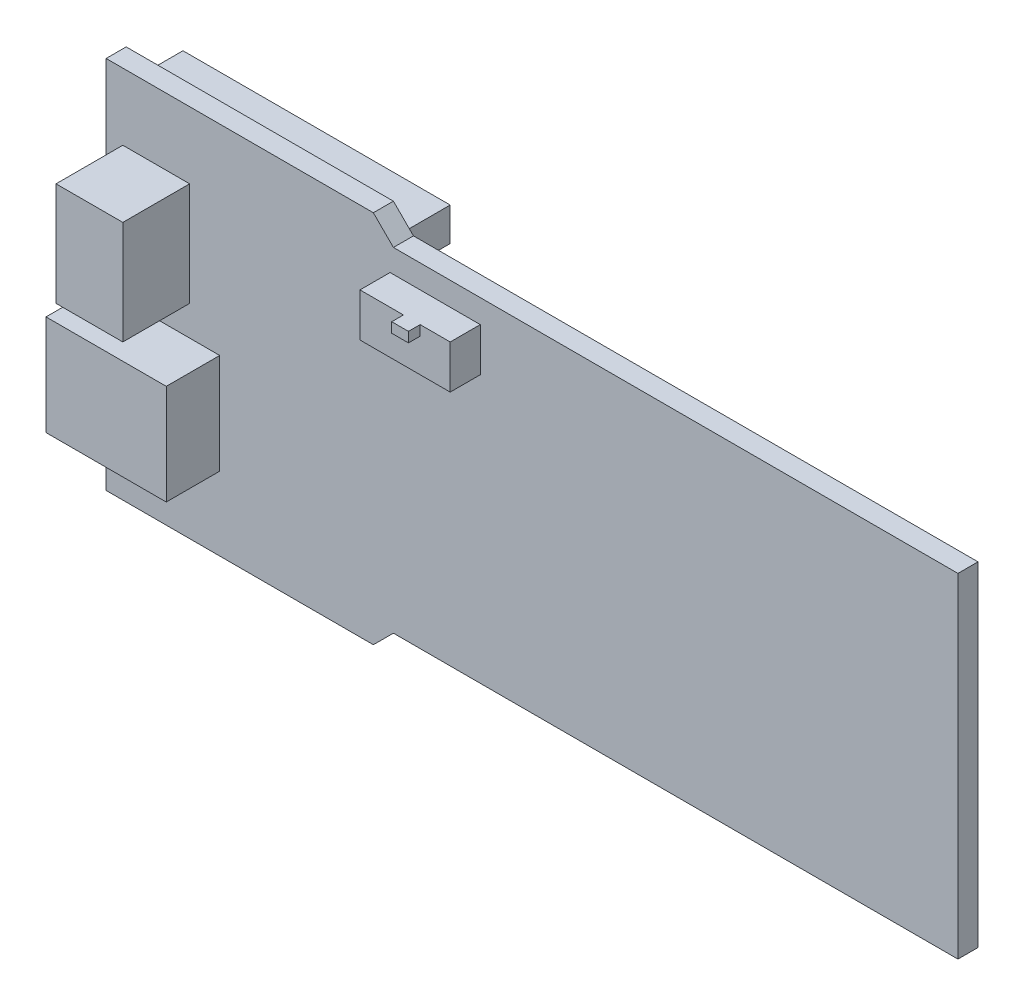
ISO-10303-21;
HEADER;
FILE_DESCRIPTION(('STEP AP214'),'2;1');
FILE_NAME('part.step','',(''),(''),'','','');
FILE_SCHEMA(('AUTOMOTIVE_DESIGN { 1 0 10303 214 1 1 1 1 }'));
ENDSEC;
DATA;
#1=APPLICATION_CONTEXT('core data for automotive mechanical design processes');
#2=APPLICATION_PROTOCOL_DEFINITION('international standard','automotive_design',2000,#1);
#3=PRODUCT_CONTEXT('',#1,'mechanical');
#4=PRODUCT('Part','Part','',(#3));
#5=PRODUCT_RELATED_PRODUCT_CATEGORY('part','',(#4));
#6=PRODUCT_DEFINITION_FORMATION('','',#4);
#7=PRODUCT_DEFINITION_CONTEXT('part definition',#1,'design');
#8=PRODUCT_DEFINITION('design','',#6,#7);
#9=PRODUCT_DEFINITION_SHAPE('','',#8);
#10=(LENGTH_UNIT() NAMED_UNIT(*) SI_UNIT(.MILLI.,.METRE.));
#11=(NAMED_UNIT(*) PLANE_ANGLE_UNIT() SI_UNIT($,.RADIAN.));
#12=(NAMED_UNIT(*) SI_UNIT($,.STERADIAN.) SOLID_ANGLE_UNIT());
#13=UNCERTAINTY_MEASURE_WITH_UNIT(LENGTH_MEASURE(1.E-05),#10,'distance_accuracy_value','');
#14=(GEOMETRIC_REPRESENTATION_CONTEXT(3) GLOBAL_UNCERTAINTY_ASSIGNED_CONTEXT((#13)) GLOBAL_UNIT_ASSIGNED_CONTEXT((#10,
#11,#12)) REPRESENTATION_CONTEXT('',''));
#15=CARTESIAN_POINT('',(0.,0.,0.));
#16=DIRECTION('',(0.,0.,1.));
#17=DIRECTION('',(1.,0.,0.));
#18=AXIS2_PLACEMENT_3D('',#15,#16,#17);
#19=CARTESIAN_POINT('',(0.,0.,3.81));
#20=DIRECTION('',(0.,0.,-1.));
#21=DIRECTION('',(-1.,0.,0.));
#22=AXIS2_PLACEMENT_3D('',#19,#20,#21);
#23=PLANE('',#22);
#24=DIRECTION('',(0.,1.,0.));
#25=VECTOR('',#24,1.);
#26=CARTESIAN_POINT('',(-6.21843810885279,10.922,3.81));
#27=LINE('',#26,#25);
#28=CARTESIAN_POINT('',(-6.21843810885279,10.16,3.81));
#29=VERTEX_POINT('',#28);
#30=CARTESIAN_POINT('',(-6.21843810885279,10.922,3.81));
#31=VERTEX_POINT('',#30);
#32=EDGE_CURVE('E36',#29,#31,#27,.T.);
#33=ORIENTED_EDGE('',*,*,#32,.F.);
#34=DIRECTION('',(1.,0.,0.));
#35=VECTOR('',#34,1.);
#36=CARTESIAN_POINT('',(-6.21843810885279,10.16,3.81));
#37=LINE('',#36,#35);
#38=CARTESIAN_POINT('',(-7.48843810885279,10.16,3.81));
#39=VERTEX_POINT('',#38);
#40=EDGE_CURVE('E270',#39,#29,#37,.T.);
#41=ORIENTED_EDGE('',*,*,#40,.F.);
#42=DIRECTION('',(0.,-1.,0.));
#43=VECTOR('',#42,1.);
#44=CARTESIAN_POINT('',(-7.48843810885279,10.922,3.81));
#45=LINE('',#44,#43);
#46=CARTESIAN_POINT('',(-7.48843810885279,10.922,3.81));
#47=VERTEX_POINT('',#46);
#48=EDGE_CURVE('E56',#47,#39,#45,.T.);
#49=ORIENTED_EDGE('',*,*,#48,.F.);
#50=DIRECTION('',(-1.,0.,0.));
#51=VECTOR('',#50,1.);
#52=CARTESIAN_POINT('',(-10.7904381088528,10.922,3.81));
#53=LINE('',#52,#51);
#54=CARTESIAN_POINT('',(-10.7904381088528,10.922,3.81));
#55=VERTEX_POINT('',#54);
#56=EDGE_CURVE('E287',#47,#55,#53,.T.);
#57=ORIENTED_EDGE('',*,*,#56,.T.);
#58=DIRECTION('',(0.,-1.,0.));
#59=VECTOR('',#58,1.);
#60=CARTESIAN_POINT('',(-10.7904381088528,7.62,3.81));
#61=LINE('',#60,#59);
#62=CARTESIAN_POINT('',(-10.7904381088528,7.62,3.81));
#63=VERTEX_POINT('',#62);
#64=EDGE_CURVE('E305',#55,#63,#61,.T.);
#65=ORIENTED_EDGE('',*,*,#64,.T.);
#66=DIRECTION('',(1.,0.,0.));
#67=VECTOR('',#66,1.);
#68=CARTESIAN_POINT('',(-10.7904381088528,7.62,3.81));
#69=LINE('',#68,#67);
#70=CARTESIAN_POINT('',(-3.93243810885279,7.62,3.81));
#71=VERTEX_POINT('',#70);
#72=EDGE_CURVE('E948',#63,#71,#69,.T.);
#73=ORIENTED_EDGE('',*,*,#72,.T.);
#74=DIRECTION('',(0.,1.,0.));
#75=VECTOR('',#74,1.);
#76=CARTESIAN_POINT('',(-3.93243810885279,7.62,3.81));
#77=LINE('',#76,#75);
#78=CARTESIAN_POINT('',(-3.93243810885279,10.922,3.81));
#79=VERTEX_POINT('',#78);
#80=EDGE_CURVE('E291',#71,#79,#77,.T.);
#81=ORIENTED_EDGE('',*,*,#80,.T.);
#82=EDGE_CURVE('E290',#79,#31,#53,.T.);
#83=ORIENTED_EDGE('',*,*,#82,.T.);
#84=EDGE_LOOP('',(#33,#41,#49,#57,#65,#73,#81,#83));
#85=FACE_BOUND('',#84,.T.);
#86=ADVANCED_FACE('F32',(#85),#23,.F.);
#87=CARTESIAN_POINT('',(0.,0.,1.524));
#88=DIRECTION('',(0.,0.,-1.));
#89=DIRECTION('',(-1.,0.,0.));
#90=AXIS2_PLACEMENT_3D('',#87,#88,#89);
#91=PLANE('',#90);
#92=DIRECTION('',(0.,-1.,0.));
#93=VECTOR('',#92,1.);
#94=CARTESIAN_POINT('',(-31.1104381088528,1.27,1.524));
#95=LINE('',#94,#93);
#96=CARTESIAN_POINT('',(-31.1104381088528,9.144,1.524));
#97=VERTEX_POINT('',#96);
#98=CARTESIAN_POINT('',(-31.1104381088528,1.27,1.524));
#99=VERTEX_POINT('',#98);
#100=EDGE_CURVE('E379',#97,#99,#95,.T.);
#101=ORIENTED_EDGE('',*,*,#100,.F.);
#102=DIRECTION('',(-1.,0.,0.));
#103=VECTOR('',#102,1.);
#104=CARTESIAN_POINT('',(-31.1104381088528,9.144,1.524));
#105=LINE('',#104,#103);
#106=CARTESIAN_POINT('',(-26.0304381088528,9.144,1.524));
#107=VERTEX_POINT('',#106);
#108=EDGE_CURVE('E384',#107,#97,#105,.T.);
#109=ORIENTED_EDGE('',*,*,#108,.F.);
#110=DIRECTION('',(0.,1.,0.));
#111=VECTOR('',#110,1.);
#112=CARTESIAN_POINT('',(-26.0304381088528,1.27,1.524));
#113=LINE('',#112,#111);
#114=CARTESIAN_POINT('',(-26.0304381088528,1.27,1.524));
#115=VERTEX_POINT('',#114);
#116=EDGE_CURVE('E396',#115,#107,#113,.T.);
#117=ORIENTED_EDGE('',*,*,#116,.F.);
#118=DIRECTION('',(1.,0.,0.));
#119=VECTOR('',#118,1.);
#120=CARTESIAN_POINT('',(-31.1104381088528,1.27,1.524));
#121=LINE('',#120,#119);
#122=EDGE_CURVE('E393',#99,#115,#121,.T.);
#123=ORIENTED_EDGE('',*,*,#122,.F.);
#124=EDGE_LOOP('',(#101,#109,#117,#123));
#125=FACE_BOUND('',#124,.T.);
#126=DIRECTION('',(-1.,0.,0.));
#127=VECTOR('',#126,1.);
#128=CARTESIAN_POINT('',(-32.8884381088528,-1.016,1.524));
#129=LINE('',#128,#127);
#130=CARTESIAN_POINT('',(-23.7444381088528,-1.016,1.524));
#131=VERTEX_POINT('',#130);
#132=CARTESIAN_POINT('',(-32.3804381088528,-1.016,1.524));
#133=VERTEX_POINT('',#132);
#134=EDGE_CURVE('E417',#131,#133,#129,.T.);
#135=ORIENTED_EDGE('',*,*,#134,.F.);
#136=DIRECTION('',(0.,1.,0.));
#137=VECTOR('',#136,1.);
#138=CARTESIAN_POINT('',(-23.7444381088528,-8.636,1.524));
#139=LINE('',#138,#137);
#140=CARTESIAN_POINT('',(-23.7444381088528,-8.636,1.524));
#141=VERTEX_POINT('',#140);
#142=EDGE_CURVE('E427',#141,#131,#139,.T.);
#143=ORIENTED_EDGE('',*,*,#142,.F.);
#144=DIRECTION('',(1.,0.,0.));
#145=VECTOR('',#144,1.);
#146=CARTESIAN_POINT('',(-32.8884381088528,-8.636,1.524));
#147=LINE('',#146,#145);
#148=CARTESIAN_POINT('',(-32.3804381088528,-8.636,1.524));
#149=VERTEX_POINT('',#148);
#150=EDGE_CURVE('E11',#149,#141,#147,.T.);
#151=ORIENTED_EDGE('',*,*,#150,.F.);
#152=DIRECTION('',(0.,-1.,0.));
#153=VECTOR('',#152,1.);
#154=CARTESIAN_POINT('',(-32.3804381088528,-14.224,1.524));
#155=LINE('',#154,#153);
#156=CARTESIAN_POINT('',(-32.3804381088528,-14.224,1.524));
#157=VERTEX_POINT('',#156);
#158=EDGE_CURVE('E455',#149,#157,#155,.T.);
#159=ORIENTED_EDGE('',*,*,#158,.T.);
#160=DIRECTION('',(1.,0.,0.));
#161=VECTOR('',#160,1.);
#162=CARTESIAN_POINT('',(-32.3804381088528,-14.224,1.524));
#163=LINE('',#162,#161);
#164=CARTESIAN_POINT('',(-12.0604381088528,-14.224,1.524));
#165=VERTEX_POINT('',#164);
#166=EDGE_CURVE('E459',#157,#165,#163,.T.);
#167=ORIENTED_EDGE('',*,*,#166,.T.);
#168=DIRECTION('',(0.707106781186546,0.707106781186549,0.));
#169=VECTOR('',#168,1.);
#170=CARTESIAN_POINT('',(-12.0604381088528,-14.224,1.524));
#171=LINE('',#170,#169);
#172=CARTESIAN_POINT('',(-10.5364381088528,-12.7,1.524));
#173=VERTEX_POINT('',#172);
#174=EDGE_CURVE('E462',#165,#173,#171,.T.);
#175=ORIENTED_EDGE('',*,*,#174,.T.);
#176=DIRECTION('',(1.,0.,0.));
#177=VECTOR('',#176,1.);
#178=CARTESIAN_POINT('',(-10.5364381088528,-12.7,1.524));
#179=LINE('',#178,#177);
#180=CARTESIAN_POINT('',(32.3895617923525,-12.7,1.524));
#181=VERTEX_POINT('',#180);
#182=EDGE_CURVE('E464',#173,#181,#179,.T.);
#183=ORIENTED_EDGE('',*,*,#182,.T.);
#184=DIRECTION('',(0.,1.,0.));
#185=VECTOR('',#184,1.);
#186=CARTESIAN_POINT('',(32.3895617923525,-12.7,1.524));
#187=LINE('',#186,#185);
#188=CARTESIAN_POINT('',(32.3895617923525,12.7,1.524));
#189=VERTEX_POINT('',#188);
#190=EDGE_CURVE('E445',#181,#189,#187,.T.);
#191=ORIENTED_EDGE('',*,*,#190,.T.);
#192=DIRECTION('',(-1.,0.,0.));
#193=VECTOR('',#192,1.);
#194=CARTESIAN_POINT('',(-10.5364381088528,12.7,1.524));
#195=LINE('',#194,#193);
#196=CARTESIAN_POINT('',(-10.5364381088528,12.7,1.524));
#197=VERTEX_POINT('',#196);
#198=EDGE_CURVE('E448',#189,#197,#195,.T.);
#199=ORIENTED_EDGE('',*,*,#198,.T.);
#200=DIRECTION('',(-0.707106781186546,0.707106781186549,0.));
#201=VECTOR('',#200,1.);
#202=CARTESIAN_POINT('',(-12.0604381088528,14.224,1.524));
#203=LINE('',#202,#201);
#204=CARTESIAN_POINT('',(-12.0604381088528,14.224,1.524));
#205=VERTEX_POINT('',#204);
#206=EDGE_CURVE('E451',#197,#205,#203,.T.);
#207=ORIENTED_EDGE('',*,*,#206,.T.);
#208=DIRECTION('',(-1.,0.,0.));
#209=VECTOR('',#208,1.);
#210=CARTESIAN_POINT('',(-32.3804381088528,14.224,1.524));
#211=LINE('',#210,#209);
#212=CARTESIAN_POINT('',(-32.3804381088528,14.224,1.524));
#213=VERTEX_POINT('',#212);
#214=EDGE_CURVE('E453',#205,#213,#211,.T.);
#215=ORIENTED_EDGE('',*,*,#214,.T.);
#216=EDGE_CURVE('E456',#213,#133,#155,.T.);
#217=ORIENTED_EDGE('',*,*,#216,.T.);
#218=EDGE_LOOP('',(#135,#143,#151,#159,#167,#175,#183,#191,#199,#207,#215,#217));
#219=FACE_BOUND('',#218,.T.);
#220=DIRECTION('',(0.,-1.,0.));
#221=VECTOR('',#220,1.);
#222=CARTESIAN_POINT('',(-10.7904381088528,7.62,1.524));
#223=LINE('',#222,#221);
#224=CARTESIAN_POINT('',(-10.7904381088528,10.922,1.524));
#225=VERTEX_POINT('',#224);
#226=CARTESIAN_POINT('',(-10.7904381088528,7.62,1.524));
#227=VERTEX_POINT('',#226);
#228=EDGE_CURVE('E273',#225,#227,#223,.T.);
#229=ORIENTED_EDGE('',*,*,#228,.F.);
#230=DIRECTION('',(-1.,0.,0.));
#231=VECTOR('',#230,1.);
#232=CARTESIAN_POINT('',(-10.7904381088528,10.922,1.524));
#233=LINE('',#232,#231);
#234=CARTESIAN_POINT('',(-3.93243810885279,10.922,1.524));
#235=VERTEX_POINT('',#234);
#236=EDGE_CURVE('E303',#235,#225,#233,.T.);
#237=ORIENTED_EDGE('',*,*,#236,.F.);
#238=DIRECTION('',(0.,1.,0.));
#239=VECTOR('',#238,1.);
#240=CARTESIAN_POINT('',(-3.93243810885279,7.62,1.524));
#241=LINE('',#240,#239);
#242=CARTESIAN_POINT('',(-3.93243810885279,7.62,1.524));
#243=VERTEX_POINT('',#242);
#244=EDGE_CURVE('E300',#243,#235,#241,.T.);
#245=ORIENTED_EDGE('',*,*,#244,.F.);
#246=DIRECTION('',(1.,0.,0.));
#247=VECTOR('',#246,1.);
#248=CARTESIAN_POINT('',(-10.7904381088528,7.62,1.524));
#249=LINE('',#248,#247);
#250=EDGE_CURVE('E276',#227,#243,#249,.T.);
#251=ORIENTED_EDGE('',*,*,#250,.F.);
#252=EDGE_LOOP('',(#229,#237,#245,#251));
#253=FACE_BOUND('',#252,.T.);
#254=ADVANCED_FACE('F528',(#125,#219,#253),#91,.F.);
#255=CARTESIAN_POINT('',(0.,0.,0.));
#256=DIRECTION('',(0.,0.,-1.));
#257=DIRECTION('',(-1.,0.,0.));
#258=AXIS2_PLACEMENT_3D('',#255,#256,#257);
#259=PLANE('',#258);
#260=DIRECTION('',(0.,-1.,0.));
#261=VECTOR('',#260,1.);
#262=CARTESIAN_POINT('',(-31.8724381088528,-12.319,0.));
#263=LINE('',#262,#261);
#264=CARTESIAN_POINT('',(-31.8724381088528,-9.779,0.));
#265=VERTEX_POINT('',#264);
#266=CARTESIAN_POINT('',(-31.8724381088528,-12.319,0.));
#267=VERTEX_POINT('',#266);
#268=EDGE_CURVE('E318',#265,#267,#263,.T.);
#269=ORIENTED_EDGE('',*,*,#268,.T.);
#270=DIRECTION('',(1.,0.,0.));
#271=VECTOR('',#270,1.);
#272=CARTESIAN_POINT('',(-31.8724381088528,-12.319,0.));
#273=LINE('',#272,#271);
#274=CARTESIAN_POINT('',(-11.5524381088528,-12.319,0.));
#275=VERTEX_POINT('',#274);
#276=EDGE_CURVE('E323',#267,#275,#273,.T.);
#277=ORIENTED_EDGE('',*,*,#276,.T.);
#278=DIRECTION('',(0.,1.,0.));
#279=VECTOR('',#278,1.);
#280=CARTESIAN_POINT('',(-11.5524381088528,-12.319,0.));
#281=LINE('',#280,#279);
#282=CARTESIAN_POINT('',(-11.5524381088528,-9.779,0.));
#283=VERTEX_POINT('',#282);
#284=EDGE_CURVE('E336',#275,#283,#281,.T.);
#285=ORIENTED_EDGE('',*,*,#284,.T.);
#286=DIRECTION('',(-1.,0.,0.));
#287=VECTOR('',#286,1.);
#288=CARTESIAN_POINT('',(-31.8724381088528,-9.779,0.));
#289=LINE('',#288,#287);
#290=EDGE_CURVE('E334',#283,#265,#289,.T.);
#291=ORIENTED_EDGE('',*,*,#290,.T.);
#292=EDGE_LOOP('',(#269,#277,#285,#291));
#293=FACE_BOUND('',#292,.T.);
#294=DIRECTION('',(0.,1.,0.));
#295=VECTOR('',#294,1.);
#296=CARTESIAN_POINT('',(32.3895617923525,-12.7,0.));
#297=LINE('',#296,#295);
#298=CARTESIAN_POINT('',(32.3895617923525,-12.7,0.));
#299=VERTEX_POINT('',#298);
#300=CARTESIAN_POINT('',(32.3895617923525,12.7,0.));
#301=VERTEX_POINT('',#300);
#302=EDGE_CURVE('E444',#299,#301,#297,.T.);
#303=ORIENTED_EDGE('',*,*,#302,.F.);
#304=DIRECTION('',(1.,0.,0.));
#305=VECTOR('',#304,1.);
#306=CARTESIAN_POINT('',(-10.5364381088528,-12.7,0.));
#307=LINE('',#306,#305);
#308=CARTESIAN_POINT('',(-10.5364381088528,-12.7,0.));
#309=VERTEX_POINT('',#308);
#310=EDGE_CURVE('E449',#309,#299,#307,.T.);
#311=ORIENTED_EDGE('',*,*,#310,.F.);
#312=DIRECTION('',(0.707106781186546,0.707106781186549,0.));
#313=VECTOR('',#312,1.);
#314=CARTESIAN_POINT('',(-12.0604381088528,-14.224,0.));
#315=LINE('',#314,#313);
#316=CARTESIAN_POINT('',(-12.0604381088528,-14.224,0.));
#317=VERTEX_POINT('',#316);
#318=EDGE_CURVE('E479',#317,#309,#315,.T.);
#319=ORIENTED_EDGE('',*,*,#318,.F.);
#320=DIRECTION('',(1.,0.,0.));
#321=VECTOR('',#320,1.);
#322=CARTESIAN_POINT('',(-32.3804381088528,-14.224,0.));
#323=LINE('',#322,#321);
#324=CARTESIAN_POINT('',(-32.3804381088528,-14.224,0.));
#325=VERTEX_POINT('',#324);
#326=EDGE_CURVE('E477',#325,#317,#323,.T.);
#327=ORIENTED_EDGE('',*,*,#326,.F.);
#328=DIRECTION('',(0.,-1.,0.));
#329=VECTOR('',#328,1.);
#330=CARTESIAN_POINT('',(-32.3804381088528,-14.224,0.));
#331=LINE('',#330,#329);
#332=CARTESIAN_POINT('',(-32.3804381088528,14.224,0.));
#333=VERTEX_POINT('',#332);
#334=EDGE_CURVE('E475',#333,#325,#331,.T.);
#335=ORIENTED_EDGE('',*,*,#334,.F.);
#336=DIRECTION('',(-1.,0.,0.));
#337=VECTOR('',#336,1.);
#338=CARTESIAN_POINT('',(-32.3804381088528,14.224,0.));
#339=LINE('',#338,#337);
#340=CARTESIAN_POINT('',(-12.0604381088528,14.224,0.));
#341=VERTEX_POINT('',#340);
#342=EDGE_CURVE('E473',#341,#333,#339,.T.);
#343=ORIENTED_EDGE('',*,*,#342,.F.);
#344=DIRECTION('',(-0.707106781186546,0.707106781186549,0.));
#345=VECTOR('',#344,1.);
#346=CARTESIAN_POINT('',(-12.0604381088528,14.224,0.));
#347=LINE('',#346,#345);
#348=CARTESIAN_POINT('',(-10.5364381088528,12.7,0.));
#349=VERTEX_POINT('',#348);
#350=EDGE_CURVE('E471',#349,#341,#347,.T.);
#351=ORIENTED_EDGE('',*,*,#350,.F.);
#352=DIRECTION('',(-1.,0.,0.));
#353=VECTOR('',#352,1.);
#354=CARTESIAN_POINT('',(-10.5364381088528,12.7,0.));
#355=LINE('',#354,#353);
#356=EDGE_CURVE('E469',#301,#349,#355,.T.);
#357=ORIENTED_EDGE('',*,*,#356,.F.);
#358=EDGE_LOOP('',(#303,#311,#319,#327,#335,#343,#351,#357));
#359=FACE_BOUND('',#358,.T.);
#360=DIRECTION('',(1.,0.,0.));
#361=VECTOR('',#360,1.);
#362=CARTESIAN_POINT('',(-31.8724381088528,12.319,0.));
#363=LINE('',#362,#361);
#364=CARTESIAN_POINT('',(-31.8724381088528,12.319,0.));
#365=VERTEX_POINT('',#364);
#366=CARTESIAN_POINT('',(-11.5524381088528,12.319,0.));
#367=VERTEX_POINT('',#366);
#368=EDGE_CURVE('E364',#365,#367,#363,.T.);
#369=ORIENTED_EDGE('',*,*,#368,.F.);
#370=DIRECTION('',(0.,1.,0.));
#371=VECTOR('',#370,1.);
#372=CARTESIAN_POINT('',(-31.8724381088528,12.319,0.));
#373=LINE('',#372,#371);
#374=CARTESIAN_POINT('',(-31.8724381088528,9.779,0.));
#375=VERTEX_POINT('',#374);
#376=EDGE_CURVE('E350',#375,#365,#373,.T.);
#377=ORIENTED_EDGE('',*,*,#376,.F.);
#378=DIRECTION('',(-1.,0.,0.));
#379=VECTOR('',#378,1.);
#380=CARTESIAN_POINT('',(-31.8724381088528,9.779,0.));
#381=LINE('',#380,#379);
#382=CARTESIAN_POINT('',(-11.5524381088528,9.779,0.));
#383=VERTEX_POINT('',#382);
#384=EDGE_CURVE('E355',#383,#375,#381,.T.);
#385=ORIENTED_EDGE('',*,*,#384,.F.);
#386=DIRECTION('',(0.,-1.,0.));
#387=VECTOR('',#386,1.);
#388=CARTESIAN_POINT('',(-11.5524381088528,12.319,0.));
#389=LINE('',#388,#387);
#390=EDGE_CURVE('E366',#367,#383,#389,.T.);
#391=ORIENTED_EDGE('',*,*,#390,.F.);
#392=EDGE_LOOP('',(#369,#377,#385,#391));
#393=FACE_BOUND('',#392,.T.);
#394=ADVANCED_FACE('F512',(#293,#359,#393),#259,.T.);
#395=CARTESIAN_POINT('',(32.3895617923525,-12.7,1.524));
#396=DIRECTION('',(-1.,0.,0.));
#397=DIRECTION('',(0.,0.,1.));
#398=AXIS2_PLACEMENT_3D('',#395,#396,#397);
#399=PLANE('',#398);
#400=ORIENTED_EDGE('',*,*,#302,.T.);
#401=DIRECTION('',(0.,0.,-1.));
#402=VECTOR('',#401,1.);
#403=CARTESIAN_POINT('',(32.3895617923525,12.7,1.524));
#404=LINE('',#403,#402);
#405=EDGE_CURVE('E42',#189,#301,#404,.T.);
#406=ORIENTED_EDGE('',*,*,#405,.F.);
#407=ORIENTED_EDGE('',*,*,#190,.F.);
#408=DIRECTION('',(0.,0.,-1.));
#409=VECTOR('',#408,1.);
#410=CARTESIAN_POINT('',(32.3895617923525,-12.7,1.524));
#411=LINE('',#410,#409);
#412=EDGE_CURVE('E466',#181,#299,#411,.T.);
#413=ORIENTED_EDGE('',*,*,#412,.T.);
#414=EDGE_LOOP('',(#400,#406,#407,#413));
#415=FACE_BOUND('',#414,.T.);
#416=ADVANCED_FACE('F34',(#415),#399,.F.);
#417=CARTESIAN_POINT('',(-10.5364381088528,12.7,1.524));
#418=DIRECTION('',(0.,-1.,0.));
#419=DIRECTION('',(0.,0.,-1.));
#420=AXIS2_PLACEMENT_3D('',#417,#418,#419);
#421=PLANE('',#420);
#422=ORIENTED_EDGE('',*,*,#356,.T.);
#423=DIRECTION('',(0.,0.,-1.));
#424=VECTOR('',#423,1.);
#425=CARTESIAN_POINT('',(-10.5364381088528,12.7,1.524));
#426=LINE('',#425,#424);
#427=EDGE_CURVE('E499',#197,#349,#426,.T.);
#428=ORIENTED_EDGE('',*,*,#427,.F.);
#429=ORIENTED_EDGE('',*,*,#198,.F.);
#430=ORIENTED_EDGE('',*,*,#405,.T.);
#431=EDGE_LOOP('',(#422,#428,#429,#430));
#432=FACE_BOUND('',#431,.T.);
#433=ADVANCED_FACE('F504',(#432),#421,.F.);
#434=CARTESIAN_POINT('',(-12.0604381088528,14.224,1.524));
#435=DIRECTION('',(-0.707106781186549,-0.707106781186546,0.));
#436=DIRECTION('',(0.707106781186546,-0.707106781186549,0.));
#437=AXIS2_PLACEMENT_3D('',#434,#435,#436);
#438=PLANE('',#437);
#439=ORIENTED_EDGE('',*,*,#350,.T.);
#440=DIRECTION('',(0.,0.,-1.));
#441=VECTOR('',#440,1.);
#442=CARTESIAN_POINT('',(-12.0604381088528,14.224,1.524));
#443=LINE('',#442,#441);
#444=EDGE_CURVE('E496',#205,#341,#443,.T.);
#445=ORIENTED_EDGE('',*,*,#444,.F.);
#446=ORIENTED_EDGE('',*,*,#206,.F.);
#447=ORIENTED_EDGE('',*,*,#427,.T.);
#448=EDGE_LOOP('',(#439,#445,#446,#447));
#449=FACE_BOUND('',#448,.T.);
#450=ADVANCED_FACE('F520',(#449),#438,.F.);
#451=CARTESIAN_POINT('',(-32.3804381088528,14.224,1.524));
#452=DIRECTION('',(0.,-1.,0.));
#453=DIRECTION('',(1.,0.,0.));
#454=AXIS2_PLACEMENT_3D('',#451,#452,#453);
#455=PLANE('',#454);
#456=ORIENTED_EDGE('',*,*,#342,.T.);
#457=DIRECTION('',(0.,0.,-1.));
#458=VECTOR('',#457,1.);
#459=CARTESIAN_POINT('',(-32.3804381088528,14.224,1.524));
#460=LINE('',#459,#458);
#461=EDGE_CURVE('E493',#213,#333,#460,.T.);
#462=ORIENTED_EDGE('',*,*,#461,.F.);
#463=ORIENTED_EDGE('',*,*,#214,.F.);
#464=ORIENTED_EDGE('',*,*,#444,.T.);
#465=EDGE_LOOP('',(#456,#462,#463,#464));
#466=FACE_BOUND('',#465,.T.);
#467=ADVANCED_FACE('F524',(#466),#455,.F.);
#468=CARTESIAN_POINT('',(-32.3804381088528,-14.224,1.524));
#469=DIRECTION('',(1.,0.,0.));
#470=DIRECTION('',(0.,1.,0.));
#471=AXIS2_PLACEMENT_3D('',#468,#469,#470);
#472=PLANE('',#471);
#473=ORIENTED_EDGE('',*,*,#334,.T.);
#474=DIRECTION('',(0.,0.,-1.));
#475=VECTOR('',#474,1.);
#476=CARTESIAN_POINT('',(-32.3804381088528,-14.224,1.524));
#477=LINE('',#476,#475);
#478=EDGE_CURVE('E490',#157,#325,#477,.T.);
#479=ORIENTED_EDGE('',*,*,#478,.F.);
#480=ORIENTED_EDGE('',*,*,#158,.F.);
#481=EDGE_CURVE('E460',#133,#149,#155,.T.);
#482=ORIENTED_EDGE('',*,*,#481,.F.);
#483=ORIENTED_EDGE('',*,*,#216,.F.);
#484=ORIENTED_EDGE('',*,*,#461,.T.);
#485=EDGE_LOOP('',(#473,#479,#480,#482,#483,#484));
#486=FACE_BOUND('',#485,.T.);
#487=ADVANCED_FACE('F546',(#486),#472,.F.);
#488=CARTESIAN_POINT('',(-32.3804381088528,-14.224,1.524));
#489=DIRECTION('',(0.,1.,0.));
#490=DIRECTION('',(0.,0.,1.));
#491=AXIS2_PLACEMENT_3D('',#488,#489,#490);
#492=PLANE('',#491);
#493=ORIENTED_EDGE('',*,*,#326,.T.);
#494=DIRECTION('',(0.,0.,-1.));
#495=VECTOR('',#494,1.);
#496=CARTESIAN_POINT('',(-12.0604381088528,-14.224,1.524));
#497=LINE('',#496,#495);
#498=EDGE_CURVE('E487',#165,#317,#497,.T.);
#499=ORIENTED_EDGE('',*,*,#498,.F.);
#500=ORIENTED_EDGE('',*,*,#166,.F.);
#501=ORIENTED_EDGE('',*,*,#478,.T.);
#502=EDGE_LOOP('',(#493,#499,#500,#501));
#503=FACE_BOUND('',#502,.T.);
#504=ADVANCED_FACE('F541',(#503),#492,.F.);
#505=CARTESIAN_POINT('',(-12.0604381088528,-14.224,1.524));
#506=DIRECTION('',(-0.707106781186549,0.707106781186546,0.));
#507=DIRECTION('',(-0.707106781186546,-0.707106781186549,0.));
#508=AXIS2_PLACEMENT_3D('',#505,#506,#507);
#509=PLANE('',#508);
#510=ORIENTED_EDGE('',*,*,#318,.T.);
#511=DIRECTION('',(0.,0.,-1.));
#512=VECTOR('',#511,1.);
#513=CARTESIAN_POINT('',(-10.5364381088528,-12.7,1.524));
#514=LINE('',#513,#512);
#515=EDGE_CURVE('E484',#173,#309,#514,.T.);
#516=ORIENTED_EDGE('',*,*,#515,.F.);
#517=ORIENTED_EDGE('',*,*,#174,.F.);
#518=ORIENTED_EDGE('',*,*,#498,.T.);
#519=EDGE_LOOP('',(#510,#516,#517,#518));
#520=FACE_BOUND('',#519,.T.);
#521=ADVANCED_FACE('F537',(#520),#509,.F.);
#522=CARTESIAN_POINT('',(-10.5364381088528,-12.7,1.524));
#523=DIRECTION('',(0.,1.,0.));
#524=DIRECTION('',(0.,0.,1.));
#525=AXIS2_PLACEMENT_3D('',#522,#523,#524);
#526=PLANE('',#525);
#527=ORIENTED_EDGE('',*,*,#310,.T.);
#528=ORIENTED_EDGE('',*,*,#412,.F.);
#529=ORIENTED_EDGE('',*,*,#182,.F.);
#530=ORIENTED_EDGE('',*,*,#515,.T.);
#531=EDGE_LOOP('',(#527,#528,#529,#530));
#532=FACE_BOUND('',#531,.T.);
#533=ADVANCED_FACE('F535',(#532),#526,.F.);
#534=CARTESIAN_POINT('',(-32.8884381088528,-8.636,5.588));
#535=DIRECTION('',(1.,0.,0.));
#536=DIRECTION('',(0.,0.,-1.));
#537=AXIS2_PLACEMENT_3D('',#534,#535,#536);
#538=PLANE('',#537);
#539=DIRECTION('',(0.,-1.,0.));
#540=VECTOR('',#539,1.);
#541=CARTESIAN_POINT('',(-32.8884381088528,-8.636,1.524));
#542=LINE('',#541,#540);
#543=CARTESIAN_POINT('',(-32.8884381088528,-1.016,1.524));
#544=VERTEX_POINT('',#543);
#545=CARTESIAN_POINT('',(-32.8884381088528,-8.636,1.524));
#546=VERTEX_POINT('',#545);
#547=EDGE_CURVE('E412',#544,#546,#542,.T.);
#548=ORIENTED_EDGE('',*,*,#547,.T.);
#549=DIRECTION('',(0.,0.,-1.));
#550=VECTOR('',#549,1.);
#551=CARTESIAN_POINT('',(-32.8884381088528,-8.636,5.588));
#552=LINE('',#551,#550);
#553=CARTESIAN_POINT('',(-32.8884381088528,-8.636,5.588));
#554=VERTEX_POINT('',#553);
#555=EDGE_CURVE('E441',#554,#546,#552,.T.);
#556=ORIENTED_EDGE('',*,*,#555,.F.);
#557=DIRECTION('',(0.,-1.,0.));
#558=VECTOR('',#557,1.);
#559=CARTESIAN_POINT('',(-32.8884381088528,-8.636,5.588));
#560=LINE('',#559,#558);
#561=CARTESIAN_POINT('',(-32.8884381088528,-1.016,5.588));
#562=VERTEX_POINT('',#561);
#563=EDGE_CURVE('E413',#562,#554,#560,.T.);
#564=ORIENTED_EDGE('',*,*,#563,.F.);
#565=DIRECTION('',(0.,0.,-1.));
#566=VECTOR('',#565,1.);
#567=CARTESIAN_POINT('',(-32.8884381088528,-1.016,5.588));
#568=LINE('',#567,#566);
#569=EDGE_CURVE('E423',#562,#544,#568,.T.);
#570=ORIENTED_EDGE('',*,*,#569,.T.);
#571=EDGE_LOOP('',(#548,#556,#564,#570));
#572=FACE_BOUND('',#571,.T.);
#573=ADVANCED_FACE('F564',(#572),#538,.F.);
#574=CARTESIAN_POINT('',(-32.8884381088528,-8.636,5.588));
#575=DIRECTION('',(0.,1.,0.));
#576=DIRECTION('',(0.,0.,1.));
#577=AXIS2_PLACEMENT_3D('',#574,#575,#576);
#578=PLANE('',#577);
#579=EDGE_CURVE('E44',#546,#149,#147,.T.);
#580=ORIENTED_EDGE('',*,*,#579,.T.);
#581=ORIENTED_EDGE('',*,*,#150,.T.);
#582=DIRECTION('',(0.,0.,-1.));
#583=VECTOR('',#582,1.);
#584=CARTESIAN_POINT('',(-23.7444381088528,-8.636,5.588));
#585=LINE('',#584,#583);
#586=CARTESIAN_POINT('',(-23.7444381088528,-8.636,5.588));
#587=VERTEX_POINT('',#586);
#588=EDGE_CURVE('E438',#587,#141,#585,.T.);
#589=ORIENTED_EDGE('',*,*,#588,.F.);
#590=DIRECTION('',(1.,0.,0.));
#591=VECTOR('',#590,1.);
#592=CARTESIAN_POINT('',(-32.8884381088528,-8.636,5.588));
#593=LINE('',#592,#591);
#594=EDGE_CURVE('E416',#554,#587,#593,.T.);
#595=ORIENTED_EDGE('',*,*,#594,.F.);
#596=ORIENTED_EDGE('',*,*,#555,.T.);
#597=EDGE_LOOP('',(#580,#581,#589,#595,#596));
#598=FACE_BOUND('',#597,.T.);
#599=ADVANCED_FACE('F551',(#598),#578,.F.);
#600=CARTESIAN_POINT('',(-23.7444381088528,-8.636,5.588));
#601=DIRECTION('',(-1.,0.,0.));
#602=DIRECTION('',(0.,0.,1.));
#603=AXIS2_PLACEMENT_3D('',#600,#601,#602);
#604=PLANE('',#603);
#605=ORIENTED_EDGE('',*,*,#142,.T.);
#606=DIRECTION('',(0.,0.,-1.));
#607=VECTOR('',#606,1.);
#608=CARTESIAN_POINT('',(-23.7444381088528,-1.016,5.588));
#609=LINE('',#608,#607);
#610=CARTESIAN_POINT('',(-23.7444381088528,-1.016,5.588));
#611=VERTEX_POINT('',#610);
#612=EDGE_CURVE('E435',#611,#131,#609,.T.);
#613=ORIENTED_EDGE('',*,*,#612,.F.);
#614=DIRECTION('',(0.,1.,0.));
#615=VECTOR('',#614,1.);
#616=CARTESIAN_POINT('',(-23.7444381088528,-8.636,5.588));
#617=LINE('',#616,#615);
#618=EDGE_CURVE('E419',#587,#611,#617,.T.);
#619=ORIENTED_EDGE('',*,*,#618,.F.);
#620=ORIENTED_EDGE('',*,*,#588,.T.);
#621=EDGE_LOOP('',(#605,#613,#619,#620));
#622=FACE_BOUND('',#621,.T.);
#623=ADVANCED_FACE('F554',(#622),#604,.F.);
#624=CARTESIAN_POINT('',(-32.8884381088528,-1.016,5.588));
#625=DIRECTION('',(0.,-1.,0.));
#626=DIRECTION('',(0.,0.,-1.));
#627=AXIS2_PLACEMENT_3D('',#624,#625,#626);
#628=PLANE('',#627);
#629=ORIENTED_EDGE('',*,*,#134,.T.);
#630=EDGE_CURVE('E430',#133,#544,#129,.T.);
#631=ORIENTED_EDGE('',*,*,#630,.T.);
#632=ORIENTED_EDGE('',*,*,#569,.F.);
#633=DIRECTION('',(-1.,0.,0.));
#634=VECTOR('',#633,1.);
#635=CARTESIAN_POINT('',(-32.8884381088528,-1.016,5.588));
#636=LINE('',#635,#634);
#637=EDGE_CURVE('E421',#611,#562,#636,.T.);
#638=ORIENTED_EDGE('',*,*,#637,.F.);
#639=ORIENTED_EDGE('',*,*,#612,.T.);
#640=EDGE_LOOP('',(#629,#631,#632,#638,#639));
#641=FACE_BOUND('',#640,.T.);
#642=ADVANCED_FACE('F567',(#641),#628,.F.);
#643=CARTESIAN_POINT('',(0.,0.,5.588));
#644=DIRECTION('',(0.,0.,-1.));
#645=DIRECTION('',(-1.,0.,0.));
#646=AXIS2_PLACEMENT_3D('',#643,#644,#645);
#647=PLANE('',#646);
#648=ORIENTED_EDGE('',*,*,#563,.T.);
#649=ORIENTED_EDGE('',*,*,#594,.T.);
#650=ORIENTED_EDGE('',*,*,#618,.T.);
#651=ORIENTED_EDGE('',*,*,#637,.T.);
#652=EDGE_LOOP('',(#648,#649,#650,#651));
#653=FACE_BOUND('',#652,.T.);
#654=ADVANCED_FACE('F558',(#653),#647,.F.);
#655=CARTESIAN_POINT('',(0.,0.,1.524));
#656=DIRECTION('',(0.,0.,-1.));
#657=DIRECTION('',(-1.,0.,0.));
#658=AXIS2_PLACEMENT_3D('',#655,#656,#657);
#659=PLANE('',#658);
#660=ORIENTED_EDGE('',*,*,#630,.F.);
#661=ORIENTED_EDGE('',*,*,#481,.T.);
#662=ORIENTED_EDGE('',*,*,#579,.F.);
#663=ORIENTED_EDGE('',*,*,#547,.F.);
#664=EDGE_LOOP('',(#660,#661,#662,#663));
#665=FACE_BOUND('',#664,.T.);
#666=ADVANCED_FACE('F565',(#665),#659,.T.);
#667=CARTESIAN_POINT('',(-31.1104381088528,1.27,6.604));
#668=DIRECTION('',(1.,0.,0.));
#669=DIRECTION('',(0.,1.,0.));
#670=AXIS2_PLACEMENT_3D('',#667,#668,#669);
#671=PLANE('',#670);
#672=ORIENTED_EDGE('',*,*,#100,.T.);
#673=DIRECTION('',(0.,0.,-1.));
#674=VECTOR('',#673,1.);
#675=CARTESIAN_POINT('',(-31.1104381088528,1.27,6.604));
#676=LINE('',#675,#674);
#677=CARTESIAN_POINT('',(-31.1104381088528,1.27,6.604));
#678=VERTEX_POINT('',#677);
#679=EDGE_CURVE('E409',#678,#99,#676,.T.);
#680=ORIENTED_EDGE('',*,*,#679,.F.);
#681=DIRECTION('',(0.,-1.,0.));
#682=VECTOR('',#681,1.);
#683=CARTESIAN_POINT('',(-31.1104381088528,1.27,6.604));
#684=LINE('',#683,#682);
#685=CARTESIAN_POINT('',(-31.1104381088528,9.144,6.604));
#686=VERTEX_POINT('',#685);
#687=EDGE_CURVE('E380',#686,#678,#684,.T.);
#688=ORIENTED_EDGE('',*,*,#687,.F.);
#689=DIRECTION('',(0.,0.,-1.));
#690=VECTOR('',#689,1.);
#691=CARTESIAN_POINT('',(-31.1104381088528,9.144,6.604));
#692=LINE('',#691,#690);
#693=EDGE_CURVE('E390',#686,#97,#692,.T.);
#694=ORIENTED_EDGE('',*,*,#693,.T.);
#695=EDGE_LOOP('',(#672,#680,#688,#694));
#696=FACE_BOUND('',#695,.T.);
#697=ADVANCED_FACE('F656',(#696),#671,.F.);
#698=CARTESIAN_POINT('',(-31.1104381088528,1.27,6.604));
#699=DIRECTION('',(0.,1.,0.));
#700=DIRECTION('',(0.,0.,1.));
#701=AXIS2_PLACEMENT_3D('',#698,#699,#700);
#702=PLANE('',#701);
#703=ORIENTED_EDGE('',*,*,#122,.T.);
#704=DIRECTION('',(0.,0.,-1.));
#705=VECTOR('',#704,1.);
#706=CARTESIAN_POINT('',(-26.0304381088528,1.27,6.604));
#707=LINE('',#706,#705);
#708=CARTESIAN_POINT('',(-26.0304381088528,1.27,6.604));
#709=VERTEX_POINT('',#708);
#710=EDGE_CURVE('E406',#709,#115,#707,.T.);
#711=ORIENTED_EDGE('',*,*,#710,.F.);
#712=DIRECTION('',(1.,0.,0.));
#713=VECTOR('',#712,1.);
#714=CARTESIAN_POINT('',(-31.1104381088528,1.27,6.604));
#715=LINE('',#714,#713);
#716=EDGE_CURVE('E383',#678,#709,#715,.T.);
#717=ORIENTED_EDGE('',*,*,#716,.F.);
#718=ORIENTED_EDGE('',*,*,#679,.T.);
#719=EDGE_LOOP('',(#703,#711,#717,#718));
#720=FACE_BOUND('',#719,.T.);
#721=ADVANCED_FACE('F652',(#720),#702,.F.);
#722=CARTESIAN_POINT('',(-26.0304381088528,1.27,6.604));
#723=DIRECTION('',(-1.,0.,0.));
#724=DIRECTION('',(0.,0.,1.));
#725=AXIS2_PLACEMENT_3D('',#722,#723,#724);
#726=PLANE('',#725);
#727=ORIENTED_EDGE('',*,*,#116,.T.);
#728=DIRECTION('',(0.,0.,-1.));
#729=VECTOR('',#728,1.);
#730=CARTESIAN_POINT('',(-26.0304381088528,9.144,6.604));
#731=LINE('',#730,#729);
#732=CARTESIAN_POINT('',(-26.0304381088528,9.144,6.604));
#733=VERTEX_POINT('',#732);
#734=EDGE_CURVE('E403',#733,#107,#731,.T.);
#735=ORIENTED_EDGE('',*,*,#734,.F.);
#736=DIRECTION('',(0.,1.,0.));
#737=VECTOR('',#736,1.);
#738=CARTESIAN_POINT('',(-26.0304381088528,1.27,6.604));
#739=LINE('',#738,#737);
#740=EDGE_CURVE('E386',#709,#733,#739,.T.);
#741=ORIENTED_EDGE('',*,*,#740,.F.);
#742=ORIENTED_EDGE('',*,*,#710,.T.);
#743=EDGE_LOOP('',(#727,#735,#741,#742));
#744=FACE_BOUND('',#743,.T.);
#745=ADVANCED_FACE('F648',(#744),#726,.F.);
#746=CARTESIAN_POINT('',(-31.1104381088528,9.144,6.604));
#747=DIRECTION('',(0.,-1.,0.));
#748=DIRECTION('',(1.,0.,0.));
#749=AXIS2_PLACEMENT_3D('',#746,#747,#748);
#750=PLANE('',#749);
#751=ORIENTED_EDGE('',*,*,#108,.T.);
#752=ORIENTED_EDGE('',*,*,#693,.F.);
#753=DIRECTION('',(-1.,0.,0.));
#754=VECTOR('',#753,1.);
#755=CARTESIAN_POINT('',(-31.1104381088528,9.144,6.604));
#756=LINE('',#755,#754);
#757=EDGE_CURVE('E388',#733,#686,#756,.T.);
#758=ORIENTED_EDGE('',*,*,#757,.F.);
#759=ORIENTED_EDGE('',*,*,#734,.T.);
#760=EDGE_LOOP('',(#751,#752,#758,#759));
#761=FACE_BOUND('',#760,.T.);
#762=ADVANCED_FACE('F644',(#761),#750,.F.);
#763=CARTESIAN_POINT('',(0.,0.,6.604));
#764=DIRECTION('',(0.,0.,-1.));
#765=DIRECTION('',(-1.,0.,0.));
#766=AXIS2_PLACEMENT_3D('',#763,#764,#765);
#767=PLANE('',#766);
#768=ORIENTED_EDGE('',*,*,#687,.T.);
#769=ORIENTED_EDGE('',*,*,#716,.T.);
#770=ORIENTED_EDGE('',*,*,#740,.T.);
#771=ORIENTED_EDGE('',*,*,#757,.T.);
#772=EDGE_LOOP('',(#768,#769,#770,#771));
#773=FACE_BOUND('',#772,.T.);
#774=ADVANCED_FACE('F640',(#773),#767,.F.);
#775=CARTESIAN_POINT('',(-31.8724381088528,12.319,-3.81));
#776=DIRECTION('',(1.,0.,0.));
#777=DIRECTION('',(0.,0.,-1.));
#778=AXIS2_PLACEMENT_3D('',#775,#776,#777);
#779=PLANE('',#778);
#780=ORIENTED_EDGE('',*,*,#376,.T.);
#781=DIRECTION('',(0.,0.,1.));
#782=VECTOR('',#781,1.);
#783=CARTESIAN_POINT('',(-31.8724381088528,12.319,-3.81));
#784=LINE('',#783,#782);
#785=CARTESIAN_POINT('',(-31.8724381088528,12.319,-3.81));
#786=VERTEX_POINT('',#785);
#787=EDGE_CURVE('E377',#786,#365,#784,.T.);
#788=ORIENTED_EDGE('',*,*,#787,.F.);
#789=DIRECTION('',(0.,1.,0.));
#790=VECTOR('',#789,1.);
#791=CARTESIAN_POINT('',(-31.8724381088528,12.319,-3.81));
#792=LINE('',#791,#790);
#793=CARTESIAN_POINT('',(-31.8724381088528,9.779,-3.81));
#794=VERTEX_POINT('',#793);
#795=EDGE_CURVE('E351',#794,#786,#792,.T.);
#796=ORIENTED_EDGE('',*,*,#795,.F.);
#797=DIRECTION('',(0.,0.,1.));
#798=VECTOR('',#797,1.);
#799=CARTESIAN_POINT('',(-31.8724381088528,9.779,-3.81));
#800=LINE('',#799,#798);
#801=EDGE_CURVE('E361',#794,#375,#800,.T.);
#802=ORIENTED_EDGE('',*,*,#801,.T.);
#803=EDGE_LOOP('',(#780,#788,#796,#802));
#804=FACE_BOUND('',#803,.T.);
#805=ADVANCED_FACE('F636',(#804),#779,.F.);
#806=CARTESIAN_POINT('',(-31.8724381088528,12.319,-3.81));
#807=DIRECTION('',(0.,-1.,0.));
#808=DIRECTION('',(1.,0.,0.));
#809=AXIS2_PLACEMENT_3D('',#806,#807,#808);
#810=PLANE('',#809);
#811=ORIENTED_EDGE('',*,*,#368,.T.);
#812=DIRECTION('',(0.,0.,1.));
#813=VECTOR('',#812,1.);
#814=CARTESIAN_POINT('',(-11.5524381088528,12.319,-3.81));
#815=LINE('',#814,#813);
#816=CARTESIAN_POINT('',(-11.5524381088528,12.319,-3.81));
#817=VERTEX_POINT('',#816);
#818=EDGE_CURVE('E374',#817,#367,#815,.T.);
#819=ORIENTED_EDGE('',*,*,#818,.F.);
#820=DIRECTION('',(1.,0.,0.));
#821=VECTOR('',#820,1.);
#822=CARTESIAN_POINT('',(-31.8724381088528,12.319,-3.81));
#823=LINE('',#822,#821);
#824=EDGE_CURVE('E354',#786,#817,#823,.T.);
#825=ORIENTED_EDGE('',*,*,#824,.F.);
#826=ORIENTED_EDGE('',*,*,#787,.T.);
#827=EDGE_LOOP('',(#811,#819,#825,#826));
#828=FACE_BOUND('',#827,.T.);
#829=ADVANCED_FACE('F632',(#828),#810,.F.);
#830=CARTESIAN_POINT('',(-11.5524381088528,12.319,-3.81));
#831=DIRECTION('',(-1.,0.,0.));
#832=DIRECTION('',(0.,0.,1.));
#833=AXIS2_PLACEMENT_3D('',#830,#831,#832);
#834=PLANE('',#833);
#835=ORIENTED_EDGE('',*,*,#390,.T.);
#836=DIRECTION('',(0.,0.,1.));
#837=VECTOR('',#836,1.);
#838=CARTESIAN_POINT('',(-11.5524381088528,9.779,-3.81));
#839=LINE('',#838,#837);
#840=CARTESIAN_POINT('',(-11.5524381088528,9.779,-3.81));
#841=VERTEX_POINT('',#840);
#842=EDGE_CURVE('E372',#841,#383,#839,.T.);
#843=ORIENTED_EDGE('',*,*,#842,.F.);
#844=DIRECTION('',(0.,-1.,0.));
#845=VECTOR('',#844,1.);
#846=CARTESIAN_POINT('',(-11.5524381088528,12.319,-3.81));
#847=LINE('',#846,#845);
#848=EDGE_CURVE('E357',#817,#841,#847,.T.);
#849=ORIENTED_EDGE('',*,*,#848,.F.);
#850=ORIENTED_EDGE('',*,*,#818,.T.);
#851=EDGE_LOOP('',(#835,#843,#849,#850));
#852=FACE_BOUND('',#851,.T.);
#853=ADVANCED_FACE('F628',(#852),#834,.F.);
#854=CARTESIAN_POINT('',(-31.8724381088528,9.779,-3.81));
#855=DIRECTION('',(0.,1.,0.));
#856=DIRECTION('',(-1.,0.,0.));
#857=AXIS2_PLACEMENT_3D('',#854,#855,#856);
#858=PLANE('',#857);
#859=ORIENTED_EDGE('',*,*,#384,.T.);
#860=ORIENTED_EDGE('',*,*,#801,.F.);
#861=DIRECTION('',(-1.,0.,0.));
#862=VECTOR('',#861,1.);
#863=CARTESIAN_POINT('',(-31.8724381088528,9.779,-3.81));
#864=LINE('',#863,#862);
#865=EDGE_CURVE('E359',#841,#794,#864,.T.);
#866=ORIENTED_EDGE('',*,*,#865,.F.);
#867=ORIENTED_EDGE('',*,*,#842,.T.);
#868=EDGE_LOOP('',(#859,#860,#866,#867));
#869=FACE_BOUND('',#868,.T.);
#870=ADVANCED_FACE('F624',(#869),#858,.F.);
#871=CARTESIAN_POINT('',(0.,0.,-3.81));
#872=DIRECTION('',(0.,0.,1.));
#873=DIRECTION('',(1.,0.,0.));
#874=AXIS2_PLACEMENT_3D('',#871,#872,#873);
#875=PLANE('',#874);
#876=ORIENTED_EDGE('',*,*,#795,.T.);
#877=ORIENTED_EDGE('',*,*,#824,.T.);
#878=ORIENTED_EDGE('',*,*,#848,.T.);
#879=ORIENTED_EDGE('',*,*,#865,.T.);
#880=EDGE_LOOP('',(#876,#877,#878,#879));
#881=FACE_BOUND('',#880,.T.);
#882=ADVANCED_FACE('F620',(#881),#875,.F.);
#883=CARTESIAN_POINT('',(-31.8724381088528,-12.319,-3.81));
#884=DIRECTION('',(-1.,0.,0.));
#885=DIRECTION('',(0.,0.,1.));
#886=AXIS2_PLACEMENT_3D('',#883,#884,#885);
#887=PLANE('',#886);
#888=ORIENTED_EDGE('',*,*,#268,.F.);
#889=DIRECTION('',(0.,0.,1.));
#890=VECTOR('',#889,1.);
#891=CARTESIAN_POINT('',(-31.8724381088528,-9.779,-3.81));
#892=LINE('',#891,#890);
#893=CARTESIAN_POINT('',(-31.8724381088528,-9.779,-3.81));
#894=VERTEX_POINT('',#893);
#895=EDGE_CURVE('E347',#894,#265,#892,.T.);
#896=ORIENTED_EDGE('',*,*,#895,.F.);
#897=DIRECTION('',(0.,-1.,0.));
#898=VECTOR('',#897,1.);
#899=CARTESIAN_POINT('',(-31.8724381088528,-12.319,-3.81));
#900=LINE('',#899,#898);
#901=CARTESIAN_POINT('',(-31.8724381088528,-12.319,-3.81));
#902=VERTEX_POINT('',#901);
#903=EDGE_CURVE('E319',#894,#902,#900,.T.);
#904=ORIENTED_EDGE('',*,*,#903,.T.);
#905=DIRECTION('',(0.,0.,1.));
#906=VECTOR('',#905,1.);
#907=CARTESIAN_POINT('',(-31.8724381088528,-12.319,-3.81));
#908=LINE('',#907,#906);
#909=EDGE_CURVE('E332',#902,#267,#908,.T.);
#910=ORIENTED_EDGE('',*,*,#909,.T.);
#911=EDGE_LOOP('',(#888,#896,#904,#910));
#912=FACE_BOUND('',#911,.T.);
#913=ADVANCED_FACE('F616',(#912),#887,.T.);
#914=CARTESIAN_POINT('',(-31.8724381088528,-9.779,-3.81));
#915=DIRECTION('',(0.,1.,0.));
#916=DIRECTION('',(-1.,0.,0.));
#917=AXIS2_PLACEMENT_3D('',#914,#915,#916);
#918=PLANE('',#917);
#919=ORIENTED_EDGE('',*,*,#290,.F.);
#920=DIRECTION('',(0.,0.,1.));
#921=VECTOR('',#920,1.);
#922=CARTESIAN_POINT('',(-11.5524381088528,-9.779,-3.81));
#923=LINE('',#922,#921);
#924=CARTESIAN_POINT('',(-11.5524381088528,-9.779,-3.81));
#925=VERTEX_POINT('',#924);
#926=EDGE_CURVE('E344',#925,#283,#923,.T.);
#927=ORIENTED_EDGE('',*,*,#926,.F.);
#928=DIRECTION('',(-1.,0.,0.));
#929=VECTOR('',#928,1.);
#930=CARTESIAN_POINT('',(-31.8724381088528,-9.779,-3.81));
#931=LINE('',#930,#929);
#932=EDGE_CURVE('E322',#925,#894,#931,.T.);
#933=ORIENTED_EDGE('',*,*,#932,.T.);
#934=ORIENTED_EDGE('',*,*,#895,.T.);
#935=EDGE_LOOP('',(#919,#927,#933,#934));
#936=FACE_BOUND('',#935,.T.);
#937=ADVANCED_FACE('F612',(#936),#918,.T.);
#938=CARTESIAN_POINT('',(-11.5524381088528,-12.319,-3.81));
#939=DIRECTION('',(1.,0.,0.));
#940=DIRECTION('',(0.,0.,-1.));
#941=AXIS2_PLACEMENT_3D('',#938,#939,#940);
#942=PLANE('',#941);
#943=ORIENTED_EDGE('',*,*,#284,.F.);
#944=DIRECTION('',(0.,0.,1.));
#945=VECTOR('',#944,1.);
#946=CARTESIAN_POINT('',(-11.5524381088528,-12.319,-3.81));
#947=LINE('',#946,#945);
#948=CARTESIAN_POINT('',(-11.5524381088528,-12.319,-3.81));
#949=VERTEX_POINT('',#948);
#950=EDGE_CURVE('E341',#949,#275,#947,.T.);
#951=ORIENTED_EDGE('',*,*,#950,.F.);
#952=DIRECTION('',(0.,1.,0.));
#953=VECTOR('',#952,1.);
#954=CARTESIAN_POINT('',(-11.5524381088528,-12.319,-3.81));
#955=LINE('',#954,#953);
#956=EDGE_CURVE('E326',#949,#925,#955,.T.);
#957=ORIENTED_EDGE('',*,*,#956,.T.);
#958=ORIENTED_EDGE('',*,*,#926,.T.);
#959=EDGE_LOOP('',(#943,#951,#957,#958));
#960=FACE_BOUND('',#959,.T.);
#961=ADVANCED_FACE('F608',(#960),#942,.T.);
#962=CARTESIAN_POINT('',(-31.8724381088528,-12.319,-3.81));
#963=DIRECTION('',(0.,-1.,0.));
#964=DIRECTION('',(1.,0.,0.));
#965=AXIS2_PLACEMENT_3D('',#962,#963,#964);
#966=PLANE('',#965);
#967=ORIENTED_EDGE('',*,*,#276,.F.);
#968=ORIENTED_EDGE('',*,*,#909,.F.);
#969=DIRECTION('',(1.,0.,0.));
#970=VECTOR('',#969,1.);
#971=CARTESIAN_POINT('',(-31.8724381088528,-12.319,-3.81));
#972=LINE('',#971,#970);
#973=EDGE_CURVE('E329',#902,#949,#972,.T.);
#974=ORIENTED_EDGE('',*,*,#973,.T.);
#975=ORIENTED_EDGE('',*,*,#950,.T.);
#976=EDGE_LOOP('',(#967,#968,#974,#975));
#977=FACE_BOUND('',#976,.T.);
#978=ADVANCED_FACE('F604',(#977),#966,.T.);
#979=CARTESIAN_POINT('',(0.,0.,-3.81));
#980=DIRECTION('',(0.,0.,1.));
#981=DIRECTION('',(1.,0.,0.));
#982=AXIS2_PLACEMENT_3D('',#979,#980,#981);
#983=PLANE('',#982);
#984=ORIENTED_EDGE('',*,*,#903,.F.);
#985=ORIENTED_EDGE('',*,*,#932,.F.);
#986=ORIENTED_EDGE('',*,*,#956,.F.);
#987=ORIENTED_EDGE('',*,*,#973,.F.);
#988=EDGE_LOOP('',(#984,#985,#986,#987));
#989=FACE_BOUND('',#988,.T.);
#990=ADVANCED_FACE('F600',(#989),#983,.F.);
#991=CARTESIAN_POINT('',(-10.7904381088528,7.62,3.81));
#992=DIRECTION('',(1.,0.,0.));
#993=DIRECTION('',(0.,0.,-1.));
#994=AXIS2_PLACEMENT_3D('',#991,#992,#993);
#995=PLANE('',#994);
#996=ORIENTED_EDGE('',*,*,#228,.T.);
#997=DIRECTION('',(0.,0.,-1.));
#998=VECTOR('',#997,1.);
#999=CARTESIAN_POINT('',(-10.7904381088528,7.62,3.81));
#1000=LINE('',#999,#998);
#1001=EDGE_CURVE('E315',#63,#227,#1000,.T.);
#1002=ORIENTED_EDGE('',*,*,#1001,.F.);
#1003=ORIENTED_EDGE('',*,*,#64,.F.);
#1004=DIRECTION('',(0.,0.,-1.));
#1005=VECTOR('',#1004,1.);
#1006=CARTESIAN_POINT('',(-10.7904381088528,10.922,3.81));
#1007=LINE('',#1006,#1005);
#1008=EDGE_CURVE('E306',#55,#225,#1007,.T.);
#1009=ORIENTED_EDGE('',*,*,#1008,.T.);
#1010=EDGE_LOOP('',(#996,#1002,#1003,#1009));
#1011=FACE_BOUND('',#1010,.T.);
#1012=ADVANCED_FACE('F596',(#1011),#995,.F.);
#1013=CARTESIAN_POINT('',(-10.7904381088528,7.62,3.81));
#1014=DIRECTION('',(0.,1.,0.));
#1015=DIRECTION('',(-1.,0.,0.));
#1016=AXIS2_PLACEMENT_3D('',#1013,#1014,#1015);
#1017=PLANE('',#1016);
#1018=ORIENTED_EDGE('',*,*,#250,.T.);
#1019=DIRECTION('',(0.,0.,-1.));
#1020=VECTOR('',#1019,1.);
#1021=CARTESIAN_POINT('',(-3.93243810885279,7.62,3.81));
#1022=LINE('',#1021,#1020);
#1023=EDGE_CURVE('E312',#71,#243,#1022,.T.);
#1024=ORIENTED_EDGE('',*,*,#1023,.F.);
#1025=ORIENTED_EDGE('',*,*,#72,.F.);
#1026=ORIENTED_EDGE('',*,*,#1001,.T.);
#1027=EDGE_LOOP('',(#1018,#1024,#1025,#1026));
#1028=FACE_BOUND('',#1027,.T.);
#1029=ADVANCED_FACE('F592',(#1028),#1017,.F.);
#1030=CARTESIAN_POINT('',(-3.93243810885279,7.62,3.81));
#1031=DIRECTION('',(-1.,0.,0.));
#1032=DIRECTION('',(0.,0.,1.));
#1033=AXIS2_PLACEMENT_3D('',#1030,#1031,#1032);
#1034=PLANE('',#1033);
#1035=ORIENTED_EDGE('',*,*,#244,.T.);
#1036=DIRECTION('',(0.,0.,-1.));
#1037=VECTOR('',#1036,1.);
#1038=CARTESIAN_POINT('',(-3.93243810885279,10.922,3.81));
#1039=LINE('',#1038,#1037);
#1040=EDGE_CURVE('E309',#79,#235,#1039,.T.);
#1041=ORIENTED_EDGE('',*,*,#1040,.F.);
#1042=ORIENTED_EDGE('',*,*,#80,.F.);
#1043=ORIENTED_EDGE('',*,*,#1023,.T.);
#1044=EDGE_LOOP('',(#1035,#1041,#1042,#1043));
#1045=FACE_BOUND('',#1044,.T.);
#1046=ADVANCED_FACE('F589',(#1045),#1034,.F.);
#1047=CARTESIAN_POINT('',(-10.7904381088528,10.922,3.81));
#1048=DIRECTION('',(0.,-1.,0.));
#1049=DIRECTION('',(0.,0.,-1.));
#1050=AXIS2_PLACEMENT_3D('',#1047,#1048,#1049);
#1051=PLANE('',#1050);
#1052=ORIENTED_EDGE('',*,*,#236,.T.);
#1053=ORIENTED_EDGE('',*,*,#1008,.F.);
#1054=ORIENTED_EDGE('',*,*,#56,.F.);
#1055=DIRECTION('',(0.,0.,-1.));
#1056=VECTOR('',#1055,1.);
#1057=CARTESIAN_POINT('',(-7.48843810885279,10.922,4.699));
#1058=LINE('',#1057,#1056);
#1059=CARTESIAN_POINT('',(-7.48843810885279,10.922,4.699));
#1060=VERTEX_POINT('',#1059);
#1061=EDGE_CURVE('E257',#1060,#47,#1058,.T.);
#1062=ORIENTED_EDGE('',*,*,#1061,.F.);
#1063=DIRECTION('',(-1.,0.,0.));
#1064=VECTOR('',#1063,1.);
#1065=CARTESIAN_POINT('',(-6.21843810885279,10.922,4.699));
#1066=LINE('',#1065,#1064);
#1067=CARTESIAN_POINT('',(-6.21843810885279,10.922,4.699));
#1068=VERTEX_POINT('',#1067);
#1069=EDGE_CURVE('E249',#1068,#1060,#1066,.T.);
#1070=ORIENTED_EDGE('',*,*,#1069,.F.);
#1071=DIRECTION('',(0.,0.,-1.));
#1072=VECTOR('',#1071,1.);
#1073=CARTESIAN_POINT('',(-6.21843810885279,10.922,4.699));
#1074=LINE('',#1073,#1072);
#1075=EDGE_CURVE('E255',#1068,#31,#1074,.T.);
#1076=ORIENTED_EDGE('',*,*,#1075,.T.);
#1077=ORIENTED_EDGE('',*,*,#82,.F.);
#1078=ORIENTED_EDGE('',*,*,#1040,.T.);
#1079=EDGE_LOOP('',(#1052,#1053,#1054,#1062,#1070,#1076,#1077,#1078));
#1080=FACE_BOUND('',#1079,.T.);
#1081=ADVANCED_FACE('F252',(#1080),#1051,.F.);
#1082=CARTESIAN_POINT('',(-6.21843810885279,10.922,4.699));
#1083=DIRECTION('',(-1.,0.,0.));
#1084=DIRECTION('',(0.,-1.,0.));
#1085=AXIS2_PLACEMENT_3D('',#1082,#1083,#1084);
#1086=PLANE('',#1085);
#1087=ORIENTED_EDGE('',*,*,#32,.T.);
#1088=ORIENTED_EDGE('',*,*,#1075,.F.);
#1089=DIRECTION('',(0.,1.,0.));
#1090=VECTOR('',#1089,1.);
#1091=CARTESIAN_POINT('',(-6.21843810885279,10.922,4.699));
#1092=LINE('',#1091,#1090);
#1093=CARTESIAN_POINT('',(-6.21843810885279,10.16,4.699));
#1094=VERTEX_POINT('',#1093);
#1095=EDGE_CURVE('E261',#1094,#1068,#1092,.T.);
#1096=ORIENTED_EDGE('',*,*,#1095,.F.);
#1097=DIRECTION('',(0.,0.,-1.));
#1098=VECTOR('',#1097,1.);
#1099=CARTESIAN_POINT('',(-6.21843810885279,10.16,4.699));
#1100=LINE('',#1099,#1098);
#1101=EDGE_CURVE('E940',#1094,#29,#1100,.T.);
#1102=ORIENTED_EDGE('',*,*,#1101,.T.);
#1103=EDGE_LOOP('',(#1087,#1088,#1096,#1102));
#1104=FACE_BOUND('',#1103,.T.);
#1105=ADVANCED_FACE('F272',(#1104),#1086,.F.);
#1106=CARTESIAN_POINT('',(-7.48843810885279,10.922,4.699));
#1107=DIRECTION('',(1.,0.,0.));
#1108=DIRECTION('',(0.,0.,-1.));
#1109=AXIS2_PLACEMENT_3D('',#1106,#1107,#1108);
#1110=PLANE('',#1109);
#1111=ORIENTED_EDGE('',*,*,#48,.T.);
#1112=DIRECTION('',(0.,0.,-1.));
#1113=VECTOR('',#1112,1.);
#1114=CARTESIAN_POINT('',(-7.48843810885279,10.16,4.699));
#1115=LINE('',#1114,#1113);
#1116=CARTESIAN_POINT('',(-7.48843810885279,10.16,4.699));
#1117=VERTEX_POINT('',#1116);
#1118=EDGE_CURVE('E278',#1117,#39,#1115,.T.);
#1119=ORIENTED_EDGE('',*,*,#1118,.F.);
#1120=DIRECTION('',(0.,-1.,0.));
#1121=VECTOR('',#1120,1.);
#1122=CARTESIAN_POINT('',(-7.48843810885279,10.922,4.699));
#1123=LINE('',#1122,#1121);
#1124=EDGE_CURVE('E260',#1060,#1117,#1123,.T.);
#1125=ORIENTED_EDGE('',*,*,#1124,.F.);
#1126=ORIENTED_EDGE('',*,*,#1061,.T.);
#1127=EDGE_LOOP('',(#1111,#1119,#1125,#1126));
#1128=FACE_BOUND('',#1127,.T.);
#1129=ADVANCED_FACE('F749',(#1128),#1110,.F.);
#1130=CARTESIAN_POINT('',(-6.21843810885279,10.16,4.699));
#1131=DIRECTION('',(0.,1.,0.));
#1132=DIRECTION('',(0.,0.,1.));
#1133=AXIS2_PLACEMENT_3D('',#1130,#1131,#1132);
#1134=PLANE('',#1133);
#1135=ORIENTED_EDGE('',*,*,#40,.T.);
#1136=ORIENTED_EDGE('',*,*,#1101,.F.);
#1137=DIRECTION('',(1.,0.,0.));
#1138=VECTOR('',#1137,1.);
#1139=CARTESIAN_POINT('',(-6.21843810885279,10.16,4.699));
#1140=LINE('',#1139,#1138);
#1141=EDGE_CURVE('E266',#1117,#1094,#1140,.T.);
#1142=ORIENTED_EDGE('',*,*,#1141,.F.);
#1143=ORIENTED_EDGE('',*,*,#1118,.T.);
#1144=EDGE_LOOP('',(#1135,#1136,#1142,#1143));
#1145=FACE_BOUND('',#1144,.T.);
#1146=ADVANCED_FACE('F755',(#1145),#1134,.F.);
#1147=CARTESIAN_POINT('',(0.,0.,4.699));
#1148=DIRECTION('',(0.,0.,-1.));
#1149=DIRECTION('',(-1.,0.,0.));
#1150=AXIS2_PLACEMENT_3D('',#1147,#1148,#1149);
#1151=PLANE('',#1150);
#1152=ORIENTED_EDGE('',*,*,#1095,.T.);
#1153=ORIENTED_EDGE('',*,*,#1069,.T.);
#1154=ORIENTED_EDGE('',*,*,#1124,.T.);
#1155=ORIENTED_EDGE('',*,*,#1141,.T.);
#1156=EDGE_LOOP('',(#1152,#1153,#1154,#1155));
#1157=FACE_BOUND('',#1156,.T.);
#1158=ADVANCED_FACE('F264',(#1157),#1151,.F.);
#1159=CLOSED_SHELL('',(#86,#254,#394,#416,#433,#450,#467,#487,#504,#521,#533,#573,#599,#623,
#642,#654,#666,#697,#721,#745,#762,#774,#805,#829,#853,#870,#882,#913,#937,#961,#978,#990,#1012,
#1029,#1046,#1081,#1105,#1129,#1146,#1158));
#1160=MANIFOLD_SOLID_BREP('B2',#1159);
#1161=ADVANCED_BREP_SHAPE_REPRESENTATION('',(#18,#1160),#14);
#1162=SHAPE_DEFINITION_REPRESENTATION(#9,#1161);
ENDSEC;
END-ISO-10303-21;
